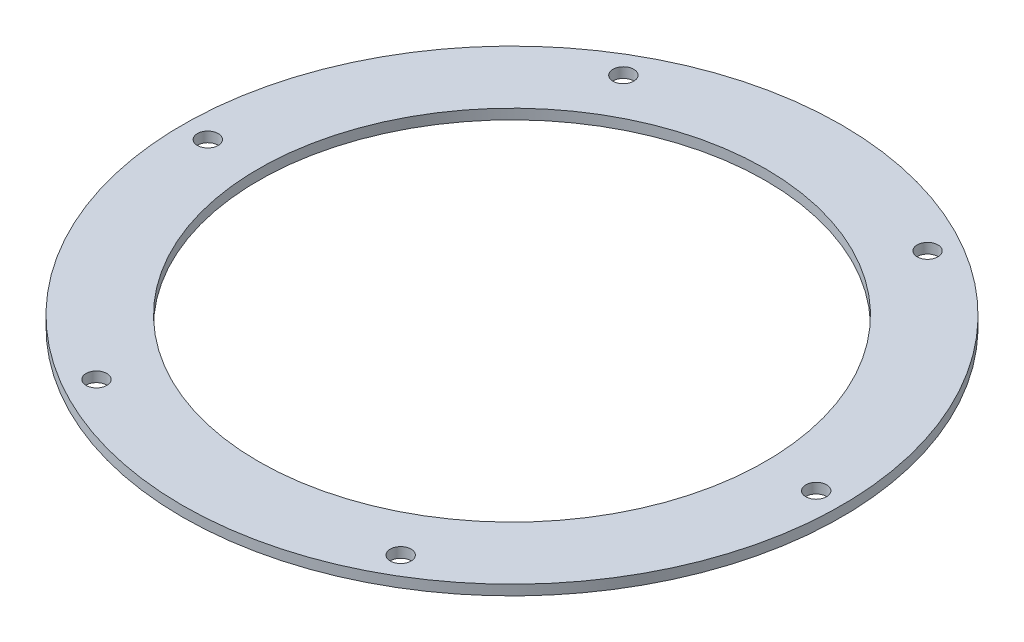
ISO-10303-21;
HEADER;
FILE_DESCRIPTION(('STEP AP214'),'2;1');
FILE_NAME('part.step','',(''),(''),'','','');
FILE_SCHEMA(('AUTOMOTIVE_DESIGN { 1 0 10303 214 1 1 1 1 }'));
ENDSEC;
DATA;
#1=APPLICATION_CONTEXT('core data for automotive mechanical design processes');
#2=APPLICATION_PROTOCOL_DEFINITION('international standard','automotive_design',2000,#1);
#3=PRODUCT_CONTEXT('',#1,'mechanical');
#4=PRODUCT('Part','Part','',(#3));
#5=PRODUCT_RELATED_PRODUCT_CATEGORY('part','',(#4));
#6=PRODUCT_DEFINITION_FORMATION('','',#4);
#7=PRODUCT_DEFINITION_CONTEXT('part definition',#1,'design');
#8=PRODUCT_DEFINITION('design','',#6,#7);
#9=PRODUCT_DEFINITION_SHAPE('','',#8);
#10=(LENGTH_UNIT() NAMED_UNIT(*) SI_UNIT(.MILLI.,.METRE.));
#11=(NAMED_UNIT(*) PLANE_ANGLE_UNIT() SI_UNIT($,.RADIAN.));
#12=(NAMED_UNIT(*) SI_UNIT($,.STERADIAN.) SOLID_ANGLE_UNIT());
#13=UNCERTAINTY_MEASURE_WITH_UNIT(LENGTH_MEASURE(1.E-05),#10,'distance_accuracy_value','');
#14=(GEOMETRIC_REPRESENTATION_CONTEXT(3) GLOBAL_UNCERTAINTY_ASSIGNED_CONTEXT((#13)) GLOBAL_UNIT_ASSIGNED_CONTEXT((#10,
#11,#12)) REPRESENTATION_CONTEXT('',''));
#15=CARTESIAN_POINT('',(0.,0.,0.));
#16=DIRECTION('',(0.,0.,1.));
#17=DIRECTION('',(1.,0.,0.));
#18=AXIS2_PLACEMENT_3D('',#15,#16,#17);
#19=CARTESIAN_POINT('',(0.,2.,0.));
#20=DIRECTION('',(0.,1.,0.));
#21=DIRECTION('',(0.,0.,1.));
#22=AXIS2_PLACEMENT_3D('',#19,#20,#21);
#23=PLANE('',#22);
#24=CARTESIAN_POINT('',(-30.,2.,-51.9615242270663));
#25=DIRECTION('',(0.,1.,0.));
#26=DIRECTION('',(0.,0.,1.));
#27=AXIS2_PLACEMENT_3D('',#24,#25,#26);
#28=CIRCLE('',#27,2.05);
#29=CARTESIAN_POINT('',(-30.,2.,-49.9115242270663));
#30=VERTEX_POINT('',#29);
#31=EDGE_CURVE('E81',#30,#30,#28,.T.);
#32=ORIENTED_EDGE('',*,*,#31,.F.);
#33=EDGE_LOOP('',(#32));
#34=FACE_BOUND('',#33,.T.);
#35=CARTESIAN_POINT('',(-30.,2.,51.9615242270663));
#36=DIRECTION('',(0.,1.,0.));
#37=DIRECTION('',(0.,0.,1.));
#38=AXIS2_PLACEMENT_3D('',#35,#36,#37);
#39=CIRCLE('',#38,2.05);
#40=CARTESIAN_POINT('',(-30.,2.,54.0115242270663));
#41=VERTEX_POINT('',#40);
#42=EDGE_CURVE('E69',#41,#41,#39,.T.);
#43=ORIENTED_EDGE('',*,*,#42,.F.);
#44=EDGE_LOOP('',(#43));
#45=FACE_BOUND('',#44,.T.);
#46=CARTESIAN_POINT('',(60.,2.,0.));
#47=DIRECTION('',(0.,1.,0.));
#48=DIRECTION('',(0.,0.,1.));
#49=AXIS2_PLACEMENT_3D('',#46,#47,#48);
#50=CIRCLE('',#49,2.04999999999999);
#51=CARTESIAN_POINT('',(60.,2.,2.04999999999999));
#52=VERTEX_POINT('',#51);
#53=EDGE_CURVE('E57',#52,#52,#50,.T.);
#54=ORIENTED_EDGE('',*,*,#53,.F.);
#55=EDGE_LOOP('',(#54));
#56=FACE_BOUND('',#55,.T.);
#57=CARTESIAN_POINT('',(0.,2.,0.));
#58=DIRECTION('',(0.,1.,0.));
#59=DIRECTION('',(0.,0.,1.));
#60=AXIS2_PLACEMENT_3D('',#57,#58,#59);
#61=CIRCLE('',#60,65.);
#62=CARTESIAN_POINT('',(0.,2.,65.));
#63=VERTEX_POINT('',#62);
#64=EDGE_CURVE('E10',#63,#63,#61,.T.);
#65=ORIENTED_EDGE('',*,*,#64,.T.);
#66=EDGE_LOOP('',(#65));
#67=FACE_BOUND('',#66,.T.);
#68=CARTESIAN_POINT('',(0.,2.,0.));
#69=DIRECTION('',(0.,1.,0.));
#70=DIRECTION('',(0.,0.,1.));
#71=AXIS2_PLACEMENT_3D('',#68,#69,#70);
#72=CIRCLE('',#71,50.);
#73=CARTESIAN_POINT('',(0.,2.,50.));
#74=VERTEX_POINT('',#73);
#75=EDGE_CURVE('E52',#74,#74,#72,.T.);
#76=ORIENTED_EDGE('',*,*,#75,.F.);
#77=EDGE_LOOP('',(#76));
#78=FACE_BOUND('',#77,.T.);
#79=CARTESIAN_POINT('',(30.,2.,51.9615242270663));
#80=DIRECTION('',(0.,1.,0.));
#81=DIRECTION('',(0.,0.,1.));
#82=AXIS2_PLACEMENT_3D('',#79,#80,#81);
#83=CIRCLE('',#82,2.05);
#84=CARTESIAN_POINT('',(30.,2.,54.0115242270663));
#85=VERTEX_POINT('',#84);
#86=EDGE_CURVE('E63',#85,#85,#83,.T.);
#87=ORIENTED_EDGE('',*,*,#86,.F.);
#88=EDGE_LOOP('',(#87));
#89=FACE_BOUND('',#88,.T.);
#90=CARTESIAN_POINT('',(-60.,2.,0.));
#91=DIRECTION('',(0.,1.,0.));
#92=DIRECTION('',(0.,0.,1.));
#93=AXIS2_PLACEMENT_3D('',#90,#91,#92);
#94=CIRCLE('',#93,2.04999999999999);
#95=CARTESIAN_POINT('',(-60.,2.,2.05));
#96=VERTEX_POINT('',#95);
#97=EDGE_CURVE('E75',#96,#96,#94,.T.);
#98=ORIENTED_EDGE('',*,*,#97,.F.);
#99=EDGE_LOOP('',(#98));
#100=FACE_BOUND('',#99,.T.);
#101=CARTESIAN_POINT('',(30.,2.,-51.9615242270663));
#102=DIRECTION('',(0.,1.,0.));
#103=DIRECTION('',(0.,0.,1.));
#104=AXIS2_PLACEMENT_3D('',#101,#102,#103);
#105=CIRCLE('',#104,2.04999999999999);
#106=CARTESIAN_POINT('',(30.,2.,-49.9115242270664));
#107=VERTEX_POINT('',#106);
#108=EDGE_CURVE('E87',#107,#107,#105,.T.);
#109=ORIENTED_EDGE('',*,*,#108,.F.);
#110=EDGE_LOOP('',(#109));
#111=FACE_BOUND('',#110,.T.);
#112=ADVANCED_FACE('F41',(#34,#45,#56,#67,#78,#89,#100,#111),#23,.T.);
#113=CARTESIAN_POINT('',(0.,0.,0.));
#114=DIRECTION('',(0.,1.,0.));
#115=DIRECTION('',(0.,0.,1.));
#116=AXIS2_PLACEMENT_3D('',#113,#114,#115);
#117=PLANE('',#116);
#118=CARTESIAN_POINT('',(0.,0.,0.));
#119=DIRECTION('',(0.,1.,0.));
#120=DIRECTION('',(0.,0.,1.));
#121=AXIS2_PLACEMENT_3D('',#118,#119,#120);
#122=CIRCLE('',#121,65.);
#123=CARTESIAN_POINT('',(0.,0.,65.));
#124=VERTEX_POINT('',#123);
#125=EDGE_CURVE('E45',#124,#124,#122,.T.);
#126=ORIENTED_EDGE('',*,*,#125,.F.);
#127=EDGE_LOOP('',(#126));
#128=FACE_BOUND('',#127,.T.);
#129=CARTESIAN_POINT('',(0.,0.,0.));
#130=DIRECTION('',(0.,1.,0.));
#131=DIRECTION('',(0.,0.,1.));
#132=AXIS2_PLACEMENT_3D('',#129,#130,#131);
#133=CIRCLE('',#132,50.);
#134=CARTESIAN_POINT('',(0.,0.,50.));
#135=VERTEX_POINT('',#134);
#136=EDGE_CURVE('E54',#135,#135,#133,.T.);
#137=ORIENTED_EDGE('',*,*,#136,.T.);
#138=EDGE_LOOP('',(#137));
#139=FACE_BOUND('',#138,.T.);
#140=CARTESIAN_POINT('',(60.,0.,0.));
#141=DIRECTION('',(0.,1.,0.));
#142=DIRECTION('',(0.,0.,1.));
#143=AXIS2_PLACEMENT_3D('',#140,#141,#142);
#144=CIRCLE('',#143,2.04999999999999);
#145=CARTESIAN_POINT('',(60.,0.,2.04999999999999));
#146=VERTEX_POINT('',#145);
#147=EDGE_CURVE('E60',#146,#146,#144,.T.);
#148=ORIENTED_EDGE('',*,*,#147,.T.);
#149=EDGE_LOOP('',(#148));
#150=FACE_BOUND('',#149,.T.);
#151=CARTESIAN_POINT('',(30.,0.,51.9615242270663));
#152=DIRECTION('',(0.,1.,0.));
#153=DIRECTION('',(0.,0.,1.));
#154=AXIS2_PLACEMENT_3D('',#151,#152,#153);
#155=CIRCLE('',#154,2.05);
#156=CARTESIAN_POINT('',(30.,0.,54.0115242270663));
#157=VERTEX_POINT('',#156);
#158=EDGE_CURVE('E66',#157,#157,#155,.T.);
#159=ORIENTED_EDGE('',*,*,#158,.T.);
#160=EDGE_LOOP('',(#159));
#161=FACE_BOUND('',#160,.T.);
#162=CARTESIAN_POINT('',(-30.,0.,51.9615242270663));
#163=DIRECTION('',(0.,1.,0.));
#164=DIRECTION('',(0.,0.,1.));
#165=AXIS2_PLACEMENT_3D('',#162,#163,#164);
#166=CIRCLE('',#165,2.05);
#167=CARTESIAN_POINT('',(-30.,0.,54.0115242270663));
#168=VERTEX_POINT('',#167);
#169=EDGE_CURVE('E72',#168,#168,#166,.T.);
#170=ORIENTED_EDGE('',*,*,#169,.T.);
#171=EDGE_LOOP('',(#170));
#172=FACE_BOUND('',#171,.T.);
#173=CARTESIAN_POINT('',(-60.,0.,0.));
#174=DIRECTION('',(0.,1.,0.));
#175=DIRECTION('',(0.,0.,1.));
#176=AXIS2_PLACEMENT_3D('',#173,#174,#175);
#177=CIRCLE('',#176,2.04999999999999);
#178=CARTESIAN_POINT('',(-60.,0.,2.05));
#179=VERTEX_POINT('',#178);
#180=EDGE_CURVE('E78',#179,#179,#177,.T.);
#181=ORIENTED_EDGE('',*,*,#180,.T.);
#182=EDGE_LOOP('',(#181));
#183=FACE_BOUND('',#182,.T.);
#184=CARTESIAN_POINT('',(-30.,0.,-51.9615242270663));
#185=DIRECTION('',(0.,1.,0.));
#186=DIRECTION('',(0.,0.,1.));
#187=AXIS2_PLACEMENT_3D('',#184,#185,#186);
#188=CIRCLE('',#187,2.05);
#189=CARTESIAN_POINT('',(-30.,0.,-49.9115242270663));
#190=VERTEX_POINT('',#189);
#191=EDGE_CURVE('E84',#190,#190,#188,.T.);
#192=ORIENTED_EDGE('',*,*,#191,.T.);
#193=EDGE_LOOP('',(#192));
#194=FACE_BOUND('',#193,.T.);
#195=CARTESIAN_POINT('',(30.,0.,-51.9615242270663));
#196=DIRECTION('',(0.,1.,0.));
#197=DIRECTION('',(0.,0.,1.));
#198=AXIS2_PLACEMENT_3D('',#195,#196,#197);
#199=CIRCLE('',#198,2.04999999999999);
#200=CARTESIAN_POINT('',(30.,0.,-49.9115242270664));
#201=VERTEX_POINT('',#200);
#202=EDGE_CURVE('E90',#201,#201,#199,.T.);
#203=ORIENTED_EDGE('',*,*,#202,.T.);
#204=EDGE_LOOP('',(#203));
#205=FACE_BOUND('',#204,.T.);
#206=ADVANCED_FACE('F100',(#128,#139,#150,#161,#172,#183,#194,#205),#117,.F.);
#207=CARTESIAN_POINT('',(0.,2.,0.));
#208=DIRECTION('',(0.,-1.,0.));
#209=DIRECTION('',(0.,0.,-1.));
#210=AXIS2_PLACEMENT_3D('',#207,#208,#209);
#211=CYLINDRICAL_SURFACE('',#210,65.);
#212=ORIENTED_EDGE('',*,*,#64,.F.);
#213=EDGE_LOOP('',(#212));
#214=FACE_BOUND('',#213,.T.);
#215=ORIENTED_EDGE('',*,*,#125,.T.);
#216=EDGE_LOOP('',(#215));
#217=FACE_BOUND('',#216,.T.);
#218=ADVANCED_FACE('F43',(#214,#217),#211,.T.);
#219=CARTESIAN_POINT('',(0.,2.,0.));
#220=DIRECTION('',(0.,-1.,0.));
#221=DIRECTION('',(0.,0.,-1.));
#222=AXIS2_PLACEMENT_3D('',#219,#220,#221);
#223=CYLINDRICAL_SURFACE('',#222,50.);
#224=ORIENTED_EDGE('',*,*,#75,.T.);
#225=EDGE_LOOP('',(#224));
#226=FACE_BOUND('',#225,.T.);
#227=ORIENTED_EDGE('',*,*,#136,.F.);
#228=EDGE_LOOP('',(#227));
#229=FACE_BOUND('',#228,.T.);
#230=ADVANCED_FACE('F110',(#226,#229),#223,.F.);
#231=CARTESIAN_POINT('',(60.,2.,0.));
#232=DIRECTION('',(0.,-1.,0.));
#233=DIRECTION('',(0.,0.,-1.));
#234=AXIS2_PLACEMENT_3D('',#231,#232,#233);
#235=CYLINDRICAL_SURFACE('',#234,2.04999999999999);
#236=ORIENTED_EDGE('',*,*,#53,.T.);
#237=EDGE_LOOP('',(#236));
#238=FACE_BOUND('',#237,.T.);
#239=ORIENTED_EDGE('',*,*,#147,.F.);
#240=EDGE_LOOP('',(#239));
#241=FACE_BOUND('',#240,.T.);
#242=ADVANCED_FACE('F113',(#238,#241),#235,.F.);
#243=CARTESIAN_POINT('',(30.,2.,51.9615242270663));
#244=DIRECTION('',(0.,-1.,0.));
#245=DIRECTION('',(0.,0.,-1.));
#246=AXIS2_PLACEMENT_3D('',#243,#244,#245);
#247=CYLINDRICAL_SURFACE('',#246,2.05);
#248=ORIENTED_EDGE('',*,*,#86,.T.);
#249=EDGE_LOOP('',(#248));
#250=FACE_BOUND('',#249,.T.);
#251=ORIENTED_EDGE('',*,*,#158,.F.);
#252=EDGE_LOOP('',(#251));
#253=FACE_BOUND('',#252,.T.);
#254=ADVANCED_FACE('F117',(#250,#253),#247,.F.);
#255=CARTESIAN_POINT('',(-30.,2.,51.9615242270663));
#256=DIRECTION('',(0.,-1.,0.));
#257=DIRECTION('',(0.,0.,-1.));
#258=AXIS2_PLACEMENT_3D('',#255,#256,#257);
#259=CYLINDRICAL_SURFACE('',#258,2.05);
#260=ORIENTED_EDGE('',*,*,#42,.T.);
#261=EDGE_LOOP('',(#260));
#262=FACE_BOUND('',#261,.T.);
#263=ORIENTED_EDGE('',*,*,#169,.F.);
#264=EDGE_LOOP('',(#263));
#265=FACE_BOUND('',#264,.T.);
#266=ADVANCED_FACE('F121',(#262,#265),#259,.F.);
#267=CARTESIAN_POINT('',(-60.,2.,0.));
#268=DIRECTION('',(0.,-1.,0.));
#269=DIRECTION('',(0.,0.,-1.));
#270=AXIS2_PLACEMENT_3D('',#267,#268,#269);
#271=CYLINDRICAL_SURFACE('',#270,2.04999999999999);
#272=ORIENTED_EDGE('',*,*,#97,.T.);
#273=EDGE_LOOP('',(#272));
#274=FACE_BOUND('',#273,.T.);
#275=ORIENTED_EDGE('',*,*,#180,.F.);
#276=EDGE_LOOP('',(#275));
#277=FACE_BOUND('',#276,.T.);
#278=ADVANCED_FACE('F125',(#274,#277),#271,.F.);
#279=CARTESIAN_POINT('',(-30.,2.,-51.9615242270663));
#280=DIRECTION('',(0.,-1.,0.));
#281=DIRECTION('',(0.,0.,-1.));
#282=AXIS2_PLACEMENT_3D('',#279,#280,#281);
#283=CYLINDRICAL_SURFACE('',#282,2.05);
#284=ORIENTED_EDGE('',*,*,#31,.T.);
#285=EDGE_LOOP('',(#284));
#286=FACE_BOUND('',#285,.T.);
#287=ORIENTED_EDGE('',*,*,#191,.F.);
#288=EDGE_LOOP('',(#287));
#289=FACE_BOUND('',#288,.T.);
#290=ADVANCED_FACE('F129',(#286,#289),#283,.F.);
#291=CARTESIAN_POINT('',(30.,2.,-51.9615242270663));
#292=DIRECTION('',(0.,-1.,0.));
#293=DIRECTION('',(0.,0.,-1.));
#294=AXIS2_PLACEMENT_3D('',#291,#292,#293);
#295=CYLINDRICAL_SURFACE('',#294,2.04999999999999);
#296=ORIENTED_EDGE('',*,*,#108,.T.);
#297=EDGE_LOOP('',(#296));
#298=FACE_BOUND('',#297,.T.);
#299=ORIENTED_EDGE('',*,*,#202,.F.);
#300=EDGE_LOOP('',(#299));
#301=FACE_BOUND('',#300,.T.);
#302=ADVANCED_FACE('F96',(#298,#301),#295,.F.);
#303=CLOSED_SHELL('',(#112,#206,#218,#230,#242,#254,#266,#278,#290,#302));
#304=MANIFOLD_SOLID_BREP('B2',#303);
#305=ADVANCED_BREP_SHAPE_REPRESENTATION('',(#18,#304),#14);
#306=SHAPE_DEFINITION_REPRESENTATION(#9,#305);
ENDSEC;
END-ISO-10303-21;
